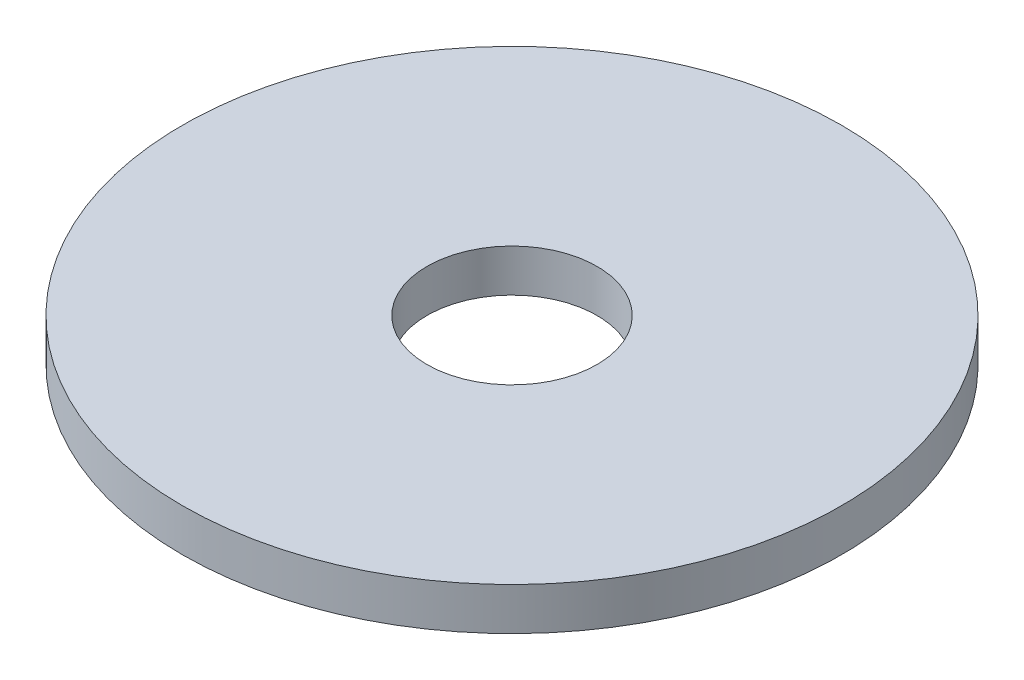
ISO-10303-21;
HEADER;
FILE_DESCRIPTION(('STEP AP214'),'2;1');
FILE_NAME('part.step','',(''),(''),'','','');
FILE_SCHEMA(('AUTOMOTIVE_DESIGN { 1 0 10303 214 1 1 1 1 }'));
ENDSEC;
DATA;
#1=APPLICATION_CONTEXT('core data for automotive mechanical design processes');
#2=APPLICATION_PROTOCOL_DEFINITION('international standard','automotive_design',2000,#1);
#3=PRODUCT_CONTEXT('',#1,'mechanical');
#4=PRODUCT('Part','Part','',(#3));
#5=PRODUCT_RELATED_PRODUCT_CATEGORY('part','',(#4));
#6=PRODUCT_DEFINITION_FORMATION('','',#4);
#7=PRODUCT_DEFINITION_CONTEXT('part definition',#1,'design');
#8=PRODUCT_DEFINITION('design','',#6,#7);
#9=PRODUCT_DEFINITION_SHAPE('','',#8);
#10=(LENGTH_UNIT() NAMED_UNIT(*) SI_UNIT(.MILLI.,.METRE.));
#11=(NAMED_UNIT(*) PLANE_ANGLE_UNIT() SI_UNIT($,.RADIAN.));
#12=(NAMED_UNIT(*) SI_UNIT($,.STERADIAN.) SOLID_ANGLE_UNIT());
#13=UNCERTAINTY_MEASURE_WITH_UNIT(LENGTH_MEASURE(1.E-05),#10,'distance_accuracy_value','');
#14=(GEOMETRIC_REPRESENTATION_CONTEXT(3) GLOBAL_UNCERTAINTY_ASSIGNED_CONTEXT((#13)) GLOBAL_UNIT_ASSIGNED_CONTEXT((#10,
#11,#12)) REPRESENTATION_CONTEXT('',''));
#15=CARTESIAN_POINT('',(0.,0.,0.));
#16=DIRECTION('',(0.,0.,1.));
#17=DIRECTION('',(1.,0.,0.));
#18=AXIS2_PLACEMENT_3D('',#15,#16,#17);
#19=CARTESIAN_POINT('',(0.,2.,0.));
#20=DIRECTION('',(0.,1.,0.));
#21=DIRECTION('',(0.,0.,1.));
#22=AXIS2_PLACEMENT_3D('',#19,#20,#21);
#23=PLANE('',#22);
#24=CARTESIAN_POINT('',(0.,2.,0.));
#25=DIRECTION('',(0.,1.,0.));
#26=DIRECTION('',(0.,0.,1.));
#27=AXIS2_PLACEMENT_3D('',#24,#25,#26);
#28=CIRCLE('',#27,15.5);
#29=CARTESIAN_POINT('',(0.,2.,15.5));
#30=VERTEX_POINT('',#29);
#31=EDGE_CURVE('E10',#30,#30,#28,.T.);
#32=ORIENTED_EDGE('',*,*,#31,.T.);
#33=EDGE_LOOP('',(#32));
#34=FACE_BOUND('',#33,.T.);
#35=CARTESIAN_POINT('',(0.,2.,0.));
#36=DIRECTION('',(0.,1.,0.));
#37=DIRECTION('',(0.,0.,1.));
#38=AXIS2_PLACEMENT_3D('',#35,#36,#37);
#39=CIRCLE('',#38,4.);
#40=CARTESIAN_POINT('',(0.,2.,4.));
#41=VERTEX_POINT('',#40);
#42=EDGE_CURVE('E47',#41,#41,#39,.T.);
#43=ORIENTED_EDGE('',*,*,#42,.F.);
#44=EDGE_LOOP('',(#43));
#45=FACE_BOUND('',#44,.T.);
#46=ADVANCED_FACE('F36',(#34,#45),#23,.T.);
#47=CARTESIAN_POINT('',(0.,0.,0.));
#48=DIRECTION('',(0.,1.,0.));
#49=DIRECTION('',(0.,0.,1.));
#50=AXIS2_PLACEMENT_3D('',#47,#48,#49);
#51=PLANE('',#50);
#52=CARTESIAN_POINT('',(0.,0.,0.));
#53=DIRECTION('',(0.,1.,0.));
#54=DIRECTION('',(0.,0.,1.));
#55=AXIS2_PLACEMENT_3D('',#52,#53,#54);
#56=CIRCLE('',#55,15.5);
#57=CARTESIAN_POINT('',(0.,0.,15.5));
#58=VERTEX_POINT('',#57);
#59=EDGE_CURVE('E40',#58,#58,#56,.T.);
#60=ORIENTED_EDGE('',*,*,#59,.F.);
#61=EDGE_LOOP('',(#60));
#62=FACE_BOUND('',#61,.T.);
#63=CARTESIAN_POINT('',(0.,0.,0.));
#64=DIRECTION('',(0.,1.,0.));
#65=DIRECTION('',(0.,0.,1.));
#66=AXIS2_PLACEMENT_3D('',#63,#64,#65);
#67=CIRCLE('',#66,4.);
#68=CARTESIAN_POINT('',(0.,0.,4.));
#69=VERTEX_POINT('',#68);
#70=EDGE_CURVE('E49',#69,#69,#67,.T.);
#71=ORIENTED_EDGE('',*,*,#70,.T.);
#72=EDGE_LOOP('',(#71));
#73=FACE_BOUND('',#72,.T.);
#74=ADVANCED_FACE('F59',(#62,#73),#51,.F.);
#75=CARTESIAN_POINT('',(0.,2.,0.));
#76=DIRECTION('',(0.,-1.,0.));
#77=DIRECTION('',(0.,0.,-1.));
#78=AXIS2_PLACEMENT_3D('',#75,#76,#77);
#79=CYLINDRICAL_SURFACE('',#78,15.5);
#80=ORIENTED_EDGE('',*,*,#31,.F.);
#81=EDGE_LOOP('',(#80));
#82=FACE_BOUND('',#81,.T.);
#83=ORIENTED_EDGE('',*,*,#59,.T.);
#84=EDGE_LOOP('',(#83));
#85=FACE_BOUND('',#84,.T.);
#86=ADVANCED_FACE('F38',(#82,#85),#79,.T.);
#87=CARTESIAN_POINT('',(0.,2.,0.));
#88=DIRECTION('',(0.,-1.,0.));
#89=DIRECTION('',(0.,0.,-1.));
#90=AXIS2_PLACEMENT_3D('',#87,#88,#89);
#91=CYLINDRICAL_SURFACE('',#90,4.);
#92=ORIENTED_EDGE('',*,*,#42,.T.);
#93=EDGE_LOOP('',(#92));
#94=FACE_BOUND('',#93,.T.);
#95=ORIENTED_EDGE('',*,*,#70,.F.);
#96=EDGE_LOOP('',(#95));
#97=FACE_BOUND('',#96,.T.);
#98=ADVANCED_FACE('F55',(#94,#97),#91,.F.);
#99=CLOSED_SHELL('',(#46,#74,#86,#98));
#100=MANIFOLD_SOLID_BREP('B2',#99);
#101=ADVANCED_BREP_SHAPE_REPRESENTATION('',(#18,#100),#14);
#102=SHAPE_DEFINITION_REPRESENTATION(#9,#101);
ENDSEC;
END-ISO-10303-21;
